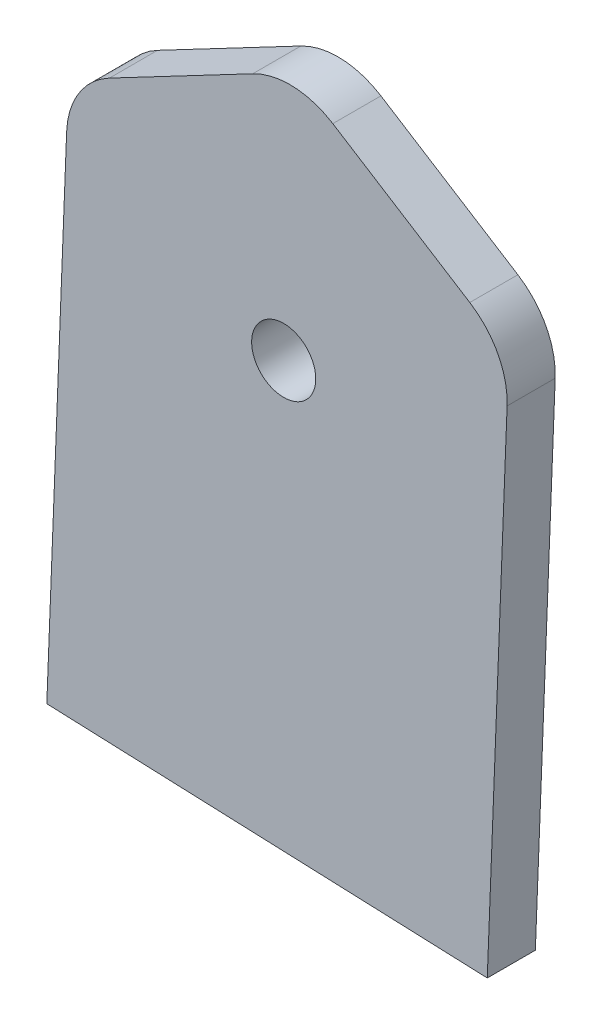
ISO-10303-21;
HEADER;
FILE_DESCRIPTION(('STEP AP214'),'2;1');
FILE_NAME('part.step','',(''),(''),'','','');
FILE_SCHEMA(('AUTOMOTIVE_DESIGN { 1 0 10303 214 1 1 1 1 }'));
ENDSEC;
DATA;
#1=APPLICATION_CONTEXT('core data for automotive mechanical design processes');
#2=APPLICATION_PROTOCOL_DEFINITION('international standard','automotive_design',2000,#1);
#3=PRODUCT_CONTEXT('',#1,'mechanical');
#4=PRODUCT('Part','Part','',(#3));
#5=PRODUCT_RELATED_PRODUCT_CATEGORY('part','',(#4));
#6=PRODUCT_DEFINITION_FORMATION('','',#4);
#7=PRODUCT_DEFINITION_CONTEXT('part definition',#1,'design');
#8=PRODUCT_DEFINITION('design','',#6,#7);
#9=PRODUCT_DEFINITION_SHAPE('','',#8);
#10=(LENGTH_UNIT() NAMED_UNIT(*) SI_UNIT(.MILLI.,.METRE.));
#11=(NAMED_UNIT(*) PLANE_ANGLE_UNIT() SI_UNIT($,.RADIAN.));
#12=(NAMED_UNIT(*) SI_UNIT($,.STERADIAN.) SOLID_ANGLE_UNIT());
#13=UNCERTAINTY_MEASURE_WITH_UNIT(LENGTH_MEASURE(1.E-05),#10,'distance_accuracy_value','');
#14=(GEOMETRIC_REPRESENTATION_CONTEXT(3) GLOBAL_UNCERTAINTY_ASSIGNED_CONTEXT((#13)) GLOBAL_UNIT_ASSIGNED_CONTEXT((#10,
#11,#12)) REPRESENTATION_CONTEXT('',''));
#15=CARTESIAN_POINT('',(0.,0.,0.));
#16=DIRECTION('',(0.,0.,1.));
#17=DIRECTION('',(1.,0.,0.));
#18=AXIS2_PLACEMENT_3D('',#15,#16,#17);
#19=CARTESIAN_POINT('',(-195.557041038628,326.429079797223,6.));
#20=DIRECTION('',(0.,0.,-1.));
#21=DIRECTION('',(-1.,0.,0.));
#22=AXIS2_PLACEMENT_3D('',#19,#20,#21);
#23=PLANE('',#22);
#24=CARTESIAN_POINT('',(-195.557041038628,326.429079797223,6.));
#25=DIRECTION('',(0.,0.,1.));
#26=DIRECTION('',(-1.,0.,0.));
#27=AXIS2_PLACEMENT_3D('',#24,#25,#26);
#28=CIRCLE('',#27,9.99999999999996);
#29=CARTESIAN_POINT('',(-200.213397344541,335.278845102155,6.));
#30=VERTEX_POINT('',#29);
#31=CARTESIAN_POINT('',(-205.549340763186,326.821439599696,6.));
#32=VERTEX_POINT('',#31);
#33=EDGE_CURVE('E168',#30,#32,#28,.T.);
#34=ORIENTED_EDGE('',*,*,#33,.T.);
#35=DIRECTION('',(-0.03923598024736,-0.999229972455805,0.));
#36=VECTOR('',#35,1.);
#37=CARTESIAN_POINT('',(-205.549340763186,326.821439599696,6.));
#38=LINE('',#37,#36);
#39=CARTESIAN_POINT('',(-208.025131116795,263.770028337736,6.));
#40=VERTEX_POINT('',#39);
#41=EDGE_CURVE('E104',#32,#40,#38,.T.);
#42=ORIENTED_EDGE('',*,*,#41,.T.);
#43=DIRECTION('',(0.999229972455804,-0.0392359802473894,0.));
#44=VECTOR('',#43,1.);
#45=CARTESIAN_POINT('',(-208.025131116795,263.770028337736,6.));
#46=LINE('',#45,#44);
#47=CARTESIAN_POINT('',(-153.067482631725,261.61204942413,6.));
#48=VERTEX_POINT('',#47);
#49=EDGE_CURVE('E189',#40,#48,#46,.T.);
#50=ORIENTED_EDGE('',*,*,#49,.T.);
#51=DIRECTION('',(0.0392359802473808,0.999229972455804,0.));
#52=VECTOR('',#51,1.);
#53=CARTESIAN_POINT('',(-153.067482631725,261.61204942413,6.));
#54=LINE('',#53,#52);
#55=CARTESIAN_POINT('',(-150.591692278116,324.663460686091,6.));
#56=VERTEX_POINT('',#55);
#57=EDGE_CURVE('E203',#48,#56,#54,.T.);
#58=ORIENTED_EDGE('',*,*,#57,.T.);
#59=CARTESIAN_POINT('',(-160.583992002674,325.055820488565,6.));
#60=DIRECTION('',(0.,0.,1.));
#61=DIRECTION('',(-1.,0.,0.));
#62=AXIS2_PLACEMENT_3D('',#59,#60,#61);
#63=CIRCLE('',#62,9.99999999999993);
#64=CARTESIAN_POINT('',(-155.248048584029,333.513225991023,6.));
#65=VERTEX_POINT('',#64);
#66=EDGE_CURVE('E123',#56,#65,#63,.T.);
#67=ORIENTED_EDGE('',*,*,#66,.T.);
#68=DIRECTION('',(-0.845740550245868,0.533594341864508,0.));
#69=VECTOR('',#68,1.);
#70=CARTESIAN_POINT('',(-172.338147286245,344.295705282998,6.));
#71=LINE('',#70,#69);
#72=CARTESIAN_POINT('',(-172.338147286245,344.295705282998,6.));
#73=VERTEX_POINT('',#72);
#74=EDGE_CURVE('E117',#65,#73,#71,.T.);
#75=ORIENTED_EDGE('',*,*,#74,.T.);
#76=CARTESIAN_POINT('',(-177.67409070489,335.838299780539,6.));
#77=DIRECTION('',(0.,0.,1.));
#78=DIRECTION('',(-1.,0.,0.));
#79=AXIS2_PLACEMENT_3D('',#76,#77,#78);
#80=CIRCLE('',#79,10.);
#81=CARTESIAN_POINT('',(-182.330447010804,344.688065085471,6.));
#82=VERTEX_POINT('',#81);
#83=EDGE_CURVE('E121',#73,#82,#80,.T.);
#84=ORIENTED_EDGE('',*,*,#83,.T.);
#85=DIRECTION('',(-0.884976530493233,-0.465635630591304,0.));
#86=VECTOR('',#85,1.);
#87=CARTESIAN_POINT('',(-200.213397344541,335.278845102155,6.));
#88=LINE('',#87,#86);
#89=EDGE_CURVE('E61',#82,#30,#88,.T.);
#90=ORIENTED_EDGE('',*,*,#89,.T.);
#91=EDGE_LOOP('',(#34,#42,#50,#58,#67,#75,#84,#90));
#92=FACE_BOUND('',#91,.T.);
#93=CARTESIAN_POINT('',(-178.467049865689,315.643862037207,6.));
#94=DIRECTION('',(0.,0.,1.));
#95=DIRECTION('',(1.,0.,0.));
#96=AXIS2_PLACEMENT_3D('',#93,#94,#95);
#97=CIRCLE('',#96,3.99999999999999);
#98=CARTESIAN_POINT('',(-174.467049865689,315.643862037207,6.));
#99=VERTEX_POINT('',#98);
#100=EDGE_CURVE('E150',#99,#99,#97,.T.);
#101=ORIENTED_EDGE('',*,*,#100,.F.);
#102=EDGE_LOOP('',(#101));
#103=FACE_BOUND('',#102,.T.);
#104=ADVANCED_FACE('F43',(#92,#103),#23,.F.);
#105=CARTESIAN_POINT('',(-195.557041038628,326.429079797223,0.));
#106=DIRECTION('',(0.,0.,-1.));
#107=DIRECTION('',(-1.,0.,0.));
#108=AXIS2_PLACEMENT_3D('',#105,#106,#107);
#109=PLANE('',#108);
#110=CARTESIAN_POINT('',(-195.557041038628,326.429079797223,0.));
#111=DIRECTION('',(0.,0.,1.));
#112=DIRECTION('',(-1.,0.,0.));
#113=AXIS2_PLACEMENT_3D('',#110,#111,#112);
#114=CIRCLE('',#113,9.99999999999996);
#115=CARTESIAN_POINT('',(-200.213397344541,335.278845102155,0.));
#116=VERTEX_POINT('',#115);
#117=CARTESIAN_POINT('',(-205.549340763186,326.821439599696,0.));
#118=VERTEX_POINT('',#117);
#119=EDGE_CURVE('E145',#116,#118,#114,.T.);
#120=ORIENTED_EDGE('',*,*,#119,.F.);
#121=DIRECTION('',(-0.884976530493233,-0.465635630591304,0.));
#122=VECTOR('',#121,1.);
#123=CARTESIAN_POINT('',(-200.213397344541,335.278845102155,0.));
#124=LINE('',#123,#122);
#125=CARTESIAN_POINT('',(-182.330447010804,344.688065085471,0.));
#126=VERTEX_POINT('',#125);
#127=EDGE_CURVE('E96',#126,#116,#124,.T.);
#128=ORIENTED_EDGE('',*,*,#127,.F.);
#129=CARTESIAN_POINT('',(-177.67409070489,335.838299780539,0.));
#130=DIRECTION('',(0.,0.,1.));
#131=DIRECTION('',(-1.,0.,0.));
#132=AXIS2_PLACEMENT_3D('',#129,#130,#131);
#133=CIRCLE('',#132,10.);
#134=CARTESIAN_POINT('',(-172.338147286245,344.295705282998,0.));
#135=VERTEX_POINT('',#134);
#136=EDGE_CURVE('E90',#135,#126,#133,.T.);
#137=ORIENTED_EDGE('',*,*,#136,.F.);
#138=DIRECTION('',(-0.845740550245868,0.533594341864508,0.));
#139=VECTOR('',#138,1.);
#140=CARTESIAN_POINT('',(-172.338147286245,344.295705282998,0.));
#141=LINE('',#140,#139);
#142=CARTESIAN_POINT('',(-155.248048584029,333.513225991023,0.));
#143=VERTEX_POINT('',#142);
#144=EDGE_CURVE('E132',#143,#135,#141,.T.);
#145=ORIENTED_EDGE('',*,*,#144,.F.);
#146=CARTESIAN_POINT('',(-160.583992002674,325.055820488565,0.));
#147=DIRECTION('',(0.,0.,1.));
#148=DIRECTION('',(-1.,0.,0.));
#149=AXIS2_PLACEMENT_3D('',#146,#147,#148);
#150=CIRCLE('',#149,9.99999999999993);
#151=CARTESIAN_POINT('',(-150.591692278116,324.663460686091,0.));
#152=VERTEX_POINT('',#151);
#153=EDGE_CURVE('E159',#152,#143,#150,.T.);
#154=ORIENTED_EDGE('',*,*,#153,.F.);
#155=DIRECTION('',(0.0392359802473808,0.999229972455804,0.));
#156=VECTOR('',#155,1.);
#157=CARTESIAN_POINT('',(-153.067482631725,261.61204942413,0.));
#158=LINE('',#157,#156);
#159=CARTESIAN_POINT('',(-153.067482631725,261.61204942413,0.));
#160=VERTEX_POINT('',#159);
#161=EDGE_CURVE('E156',#160,#152,#158,.T.);
#162=ORIENTED_EDGE('',*,*,#161,.F.);
#163=DIRECTION('',(0.999229972455804,-0.0392359802473894,0.));
#164=VECTOR('',#163,1.);
#165=CARTESIAN_POINT('',(-208.025131116795,263.770028337736,0.));
#166=LINE('',#165,#164);
#167=CARTESIAN_POINT('',(-208.025131116795,263.770028337736,0.));
#168=VERTEX_POINT('',#167);
#169=EDGE_CURVE('E153',#168,#160,#166,.T.);
#170=ORIENTED_EDGE('',*,*,#169,.F.);
#171=DIRECTION('',(-0.03923598024736,-0.999229972455805,0.));
#172=VECTOR('',#171,1.);
#173=CARTESIAN_POINT('',(-205.549340763186,326.821439599696,0.));
#174=LINE('',#173,#172);
#175=EDGE_CURVE('E149',#118,#168,#174,.T.);
#176=ORIENTED_EDGE('',*,*,#175,.F.);
#177=EDGE_LOOP('',(#120,#128,#137,#145,#154,#162,#170,#176));
#178=FACE_BOUND('',#177,.T.);
#179=CARTESIAN_POINT('',(-178.467049865689,315.643862037207,0.));
#180=DIRECTION('',(0.,0.,1.));
#181=DIRECTION('',(1.,0.,0.));
#182=AXIS2_PLACEMENT_3D('',#179,#180,#181);
#183=CIRCLE('',#182,3.99999999999999);
#184=CARTESIAN_POINT('',(-174.467049865689,315.643862037207,0.));
#185=VERTEX_POINT('',#184);
#186=EDGE_CURVE('E213',#185,#185,#183,.T.);
#187=ORIENTED_EDGE('',*,*,#186,.T.);
#188=EDGE_LOOP('',(#187));
#189=FACE_BOUND('',#188,.T.);
#190=ADVANCED_FACE('F193',(#178,#189),#109,.T.);
#191=CARTESIAN_POINT('',(-195.557041038628,326.429079797223,6.));
#192=DIRECTION('',(0.,0.,-1.));
#193=DIRECTION('',(-1.,0.,0.));
#194=AXIS2_PLACEMENT_3D('',#191,#192,#193);
#195=CYLINDRICAL_SURFACE('',#194,9.99999999999996);
#196=ORIENTED_EDGE('',*,*,#119,.T.);
#197=DIRECTION('',(0.,0.,-1.));
#198=VECTOR('',#197,1.);
#199=CARTESIAN_POINT('',(-205.549340763186,326.821439599696,6.));
#200=LINE('',#199,#198);
#201=EDGE_CURVE('E11',#32,#118,#200,.T.);
#202=ORIENTED_EDGE('',*,*,#201,.F.);
#203=ORIENTED_EDGE('',*,*,#33,.F.);
#204=DIRECTION('',(0.,0.,-1.));
#205=VECTOR('',#204,1.);
#206=CARTESIAN_POINT('',(-200.213397344541,335.278845102155,6.));
#207=LINE('',#206,#205);
#208=EDGE_CURVE('E141',#30,#116,#207,.T.);
#209=ORIENTED_EDGE('',*,*,#208,.T.);
#210=EDGE_LOOP('',(#196,#202,#203,#209));
#211=FACE_BOUND('',#210,.T.);
#212=ADVANCED_FACE('F45',(#211),#195,.T.);
#213=CARTESIAN_POINT('',(-205.549340763186,326.821439599696,6.));
#214=DIRECTION('',(0.999229972455805,-0.03923598024736,0.));
#215=DIRECTION('',(0.03923598024736,0.999229972455805,0.));
#216=AXIS2_PLACEMENT_3D('',#213,#214,#215);
#217=PLANE('',#216);
#218=ORIENTED_EDGE('',*,*,#175,.T.);
#219=DIRECTION('',(0.,0.,-1.));
#220=VECTOR('',#219,1.);
#221=CARTESIAN_POINT('',(-208.025131116795,263.770028337736,6.));
#222=LINE('',#221,#220);
#223=EDGE_CURVE('E53',#40,#168,#222,.T.);
#224=ORIENTED_EDGE('',*,*,#223,.F.);
#225=ORIENTED_EDGE('',*,*,#41,.F.);
#226=ORIENTED_EDGE('',*,*,#201,.T.);
#227=EDGE_LOOP('',(#218,#224,#225,#226));
#228=FACE_BOUND('',#227,.T.);
#229=ADVANCED_FACE('F243',(#228),#217,.F.);
#230=CARTESIAN_POINT('',(-208.025131116795,263.770028337736,6.));
#231=DIRECTION('',(0.0392359802473894,0.999229972455804,0.));
#232=DIRECTION('',(-0.999229972455804,0.0392359802473894,0.));
#233=AXIS2_PLACEMENT_3D('',#230,#231,#232);
#234=PLANE('',#233);
#235=ORIENTED_EDGE('',*,*,#169,.T.);
#236=DIRECTION('',(0.,0.,-1.));
#237=VECTOR('',#236,1.);
#238=CARTESIAN_POINT('',(-153.067482631725,261.61204942413,6.));
#239=LINE('',#238,#237);
#240=EDGE_CURVE('E179',#48,#160,#239,.T.);
#241=ORIENTED_EDGE('',*,*,#240,.F.);
#242=ORIENTED_EDGE('',*,*,#49,.F.);
#243=ORIENTED_EDGE('',*,*,#223,.T.);
#244=EDGE_LOOP('',(#235,#241,#242,#243));
#245=FACE_BOUND('',#244,.T.);
#246=ADVANCED_FACE('F187',(#245),#234,.F.);
#247=CARTESIAN_POINT('',(-153.067482631725,261.61204942413,6.));
#248=DIRECTION('',(-0.999229972455804,0.0392359802473808,0.));
#249=DIRECTION('',(-0.0392359802473808,-0.999229972455804,0.));
#250=AXIS2_PLACEMENT_3D('',#247,#248,#249);
#251=PLANE('',#250);
#252=ORIENTED_EDGE('',*,*,#161,.T.);
#253=DIRECTION('',(0.,0.,-1.));
#254=VECTOR('',#253,1.);
#255=CARTESIAN_POINT('',(-150.591692278116,324.663460686091,6.));
#256=LINE('',#255,#254);
#257=EDGE_CURVE('E175',#56,#152,#256,.T.);
#258=ORIENTED_EDGE('',*,*,#257,.F.);
#259=ORIENTED_EDGE('',*,*,#57,.F.);
#260=ORIENTED_EDGE('',*,*,#240,.T.);
#261=EDGE_LOOP('',(#252,#258,#259,#260));
#262=FACE_BOUND('',#261,.T.);
#263=ADVANCED_FACE('F198',(#262),#251,.F.);
#264=CARTESIAN_POINT('',(-160.583992002674,325.055820488565,6.));
#265=DIRECTION('',(0.,0.,-1.));
#266=DIRECTION('',(-1.,0.,0.));
#267=AXIS2_PLACEMENT_3D('',#264,#265,#266);
#268=CYLINDRICAL_SURFACE('',#267,9.99999999999993);
#269=ORIENTED_EDGE('',*,*,#153,.T.);
#270=DIRECTION('',(0.,0.,-1.));
#271=VECTOR('',#270,1.);
#272=CARTESIAN_POINT('',(-155.248048584029,333.513225991023,6.));
#273=LINE('',#272,#271);
#274=EDGE_CURVE('E134',#65,#143,#273,.T.);
#275=ORIENTED_EDGE('',*,*,#274,.F.);
#276=ORIENTED_EDGE('',*,*,#66,.F.);
#277=ORIENTED_EDGE('',*,*,#257,.T.);
#278=EDGE_LOOP('',(#269,#275,#276,#277));
#279=FACE_BOUND('',#278,.T.);
#280=ADVANCED_FACE('F201',(#279),#268,.T.);
#281=CARTESIAN_POINT('',(-172.338147286245,344.295705282998,6.));
#282=DIRECTION('',(-0.533594341864508,-0.845740550245868,0.));
#283=DIRECTION('',(0.845740550245868,-0.533594341864508,0.));
#284=AXIS2_PLACEMENT_3D('',#281,#282,#283);
#285=PLANE('',#284);
#286=ORIENTED_EDGE('',*,*,#144,.T.);
#287=DIRECTION('',(0.,0.,-1.));
#288=VECTOR('',#287,1.);
#289=CARTESIAN_POINT('',(-172.338147286245,344.295705282998,6.));
#290=LINE('',#289,#288);
#291=EDGE_CURVE('E129',#73,#135,#290,.T.);
#292=ORIENTED_EDGE('',*,*,#291,.F.);
#293=ORIENTED_EDGE('',*,*,#74,.F.);
#294=ORIENTED_EDGE('',*,*,#274,.T.);
#295=EDGE_LOOP('',(#286,#292,#293,#294));
#296=FACE_BOUND('',#295,.T.);
#297=ADVANCED_FACE('F130',(#296),#285,.F.);
#298=CARTESIAN_POINT('',(-177.67409070489,335.838299780539,6.));
#299=DIRECTION('',(0.,0.,-1.));
#300=DIRECTION('',(-1.,0.,0.));
#301=AXIS2_PLACEMENT_3D('',#298,#299,#300);
#302=CYLINDRICAL_SURFACE('',#301,10.);
#303=ORIENTED_EDGE('',*,*,#136,.T.);
#304=DIRECTION('',(0.,0.,-1.));
#305=VECTOR('',#304,1.);
#306=CARTESIAN_POINT('',(-182.330447010804,344.688065085471,6.));
#307=LINE('',#306,#305);
#308=EDGE_CURVE('E135',#82,#126,#307,.T.);
#309=ORIENTED_EDGE('',*,*,#308,.F.);
#310=ORIENTED_EDGE('',*,*,#83,.F.);
#311=ORIENTED_EDGE('',*,*,#291,.T.);
#312=EDGE_LOOP('',(#303,#309,#310,#311));
#313=FACE_BOUND('',#312,.T.);
#314=ADVANCED_FACE('F137',(#313),#302,.T.);
#315=CARTESIAN_POINT('',(-200.213397344541,335.278845102155,6.));
#316=DIRECTION('',(0.465635630591304,-0.884976530493232,0.));
#317=DIRECTION('',(0.884976530493233,0.465635630591304,0.));
#318=AXIS2_PLACEMENT_3D('',#315,#316,#317);
#319=PLANE('',#318);
#320=ORIENTED_EDGE('',*,*,#127,.T.);
#321=ORIENTED_EDGE('',*,*,#208,.F.);
#322=ORIENTED_EDGE('',*,*,#89,.F.);
#323=ORIENTED_EDGE('',*,*,#308,.T.);
#324=EDGE_LOOP('',(#320,#321,#322,#323));
#325=FACE_BOUND('',#324,.T.);
#326=ADVANCED_FACE('F231',(#325),#319,.F.);
#327=CARTESIAN_POINT('',(-178.467049865689,315.643862037207,6.));
#328=DIRECTION('',(0.,0.,-1.));
#329=DIRECTION('',(-1.,0.,0.));
#330=AXIS2_PLACEMENT_3D('',#327,#328,#329);
#331=CYLINDRICAL_SURFACE('',#330,3.99999999999999);
#332=ORIENTED_EDGE('',*,*,#100,.T.);
#333=EDGE_LOOP('',(#332));
#334=FACE_BOUND('',#333,.T.);
#335=ORIENTED_EDGE('',*,*,#186,.F.);
#336=EDGE_LOOP('',(#335));
#337=FACE_BOUND('',#336,.T.);
#338=ADVANCED_FACE('F221',(#334,#337),#331,.F.);
#339=CLOSED_SHELL('',(#104,#190,#212,#229,#246,#263,#280,#297,#314,#326,#338));
#340=MANIFOLD_SOLID_BREP('B2',#339);
#341=ADVANCED_BREP_SHAPE_REPRESENTATION('',(#18,#340),#14);
#342=SHAPE_DEFINITION_REPRESENTATION(#9,#341);
ENDSEC;
END-ISO-10303-21;
